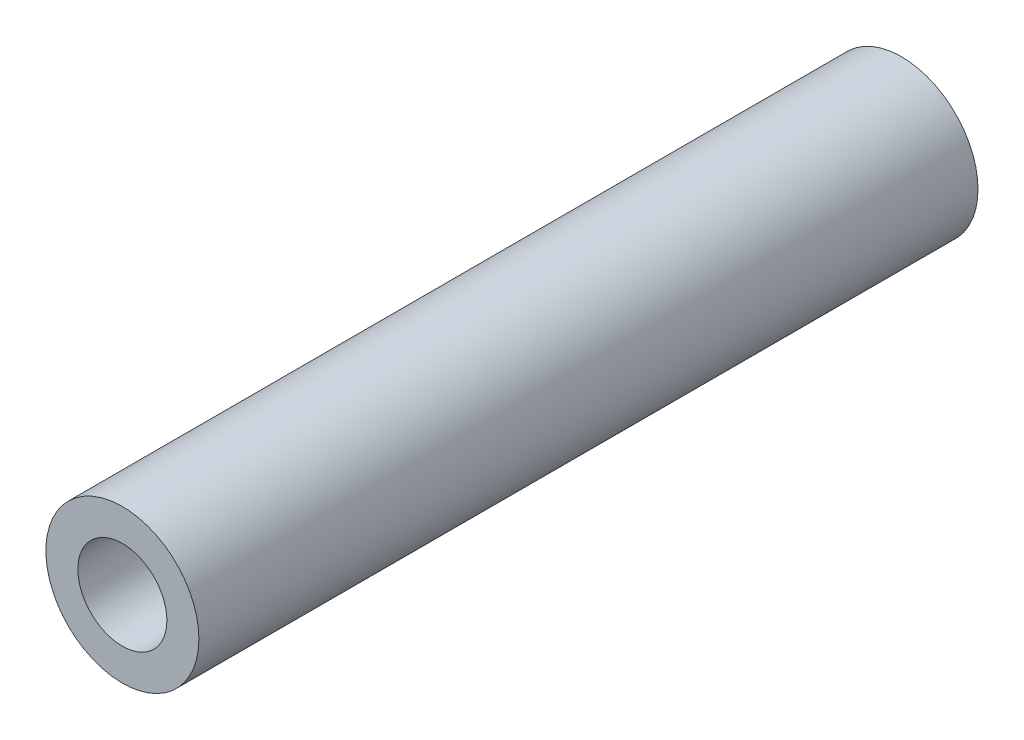
ISO-10303-21;
HEADER;
FILE_DESCRIPTION(('STEP AP214'),'2;1');
FILE_NAME('part.step','',(''),(''),'','','');
FILE_SCHEMA(('AUTOMOTIVE_DESIGN { 1 0 10303 214 1 1 1 1 }'));
ENDSEC;
DATA;
#1=APPLICATION_CONTEXT('core data for automotive mechanical design processes');
#2=APPLICATION_PROTOCOL_DEFINITION('international standard','automotive_design',2000,#1);
#3=PRODUCT_CONTEXT('',#1,'mechanical');
#4=PRODUCT('Part','Part','',(#3));
#5=PRODUCT_RELATED_PRODUCT_CATEGORY('part','',(#4));
#6=PRODUCT_DEFINITION_FORMATION('','',#4);
#7=PRODUCT_DEFINITION_CONTEXT('part definition',#1,'design');
#8=PRODUCT_DEFINITION('design','',#6,#7);
#9=PRODUCT_DEFINITION_SHAPE('','',#8);
#10=(LENGTH_UNIT() NAMED_UNIT(*) SI_UNIT(.MILLI.,.METRE.));
#11=(NAMED_UNIT(*) PLANE_ANGLE_UNIT() SI_UNIT($,.RADIAN.));
#12=(NAMED_UNIT(*) SI_UNIT($,.STERADIAN.) SOLID_ANGLE_UNIT());
#13=UNCERTAINTY_MEASURE_WITH_UNIT(LENGTH_MEASURE(1.E-05),#10,'distance_accuracy_value','');
#14=(GEOMETRIC_REPRESENTATION_CONTEXT(3) GLOBAL_UNCERTAINTY_ASSIGNED_CONTEXT((#13)) GLOBAL_UNIT_ASSIGNED_CONTEXT((#10,
#11,#12)) REPRESENTATION_CONTEXT('',''));
#15=CARTESIAN_POINT('',(0.,0.,0.));
#16=DIRECTION('',(0.,0.,1.));
#17=DIRECTION('',(1.,0.,0.));
#18=AXIS2_PLACEMENT_3D('',#15,#16,#17);
#19=CARTESIAN_POINT('',(0.,0.,28.));
#20=DIRECTION('',(0.,0.,1.));
#21=DIRECTION('',(1.,0.,0.));
#22=AXIS2_PLACEMENT_3D('',#19,#20,#21);
#23=PLANE('',#22);
#24=CARTESIAN_POINT('',(0.,0.,28.));
#25=DIRECTION('',(0.,0.,1.));
#26=DIRECTION('',(1.,0.,0.));
#27=AXIS2_PLACEMENT_3D('',#24,#25,#26);
#28=CIRCLE('',#27,2.75);
#29=CARTESIAN_POINT('',(2.75,0.,28.));
#30=VERTEX_POINT('',#29);
#31=EDGE_CURVE('E10',#30,#30,#28,.T.);
#32=ORIENTED_EDGE('',*,*,#31,.T.);
#33=EDGE_LOOP('',(#32));
#34=FACE_BOUND('',#33,.T.);
#35=CARTESIAN_POINT('',(0.,0.,28.));
#36=DIRECTION('',(0.,0.,1.));
#37=DIRECTION('',(1.,0.,0.));
#38=AXIS2_PLACEMENT_3D('',#35,#36,#37);
#39=CIRCLE('',#38,1.6);
#40=CARTESIAN_POINT('',(1.6,0.,28.));
#41=VERTEX_POINT('',#40);
#42=EDGE_CURVE('E50',#41,#41,#39,.T.);
#43=ORIENTED_EDGE('',*,*,#42,.F.);
#44=EDGE_LOOP('',(#43));
#45=FACE_BOUND('',#44,.T.);
#46=ADVANCED_FACE('F37',(#34,#45),#23,.T.);
#47=CARTESIAN_POINT('',(0.,0.,0.));
#48=DIRECTION('',(0.,0.,1.));
#49=DIRECTION('',(1.,0.,0.));
#50=AXIS2_PLACEMENT_3D('',#47,#48,#49);
#51=PLANE('',#50);
#52=CARTESIAN_POINT('',(0.,0.,0.));
#53=DIRECTION('',(0.,0.,1.));
#54=DIRECTION('',(1.,0.,0.));
#55=AXIS2_PLACEMENT_3D('',#52,#53,#54);
#56=CIRCLE('',#55,2.75);
#57=CARTESIAN_POINT('',(2.75,0.,0.));
#58=VERTEX_POINT('',#57);
#59=EDGE_CURVE('E41',#58,#58,#56,.T.);
#60=ORIENTED_EDGE('',*,*,#59,.F.);
#61=EDGE_LOOP('',(#60));
#62=FACE_BOUND('',#61,.T.);
#63=CARTESIAN_POINT('',(0.,0.,0.));
#64=DIRECTION('',(0.,0.,1.));
#65=DIRECTION('',(1.,0.,0.));
#66=AXIS2_PLACEMENT_3D('',#63,#64,#65);
#67=CIRCLE('',#66,1.6);
#68=CARTESIAN_POINT('',(1.6,0.,0.));
#69=VERTEX_POINT('',#68);
#70=EDGE_CURVE('E52',#69,#69,#67,.T.);
#71=ORIENTED_EDGE('',*,*,#70,.T.);
#72=EDGE_LOOP('',(#71));
#73=FACE_BOUND('',#72,.T.);
#74=ADVANCED_FACE('F64',(#62,#73),#51,.F.);
#75=CARTESIAN_POINT('',(0.,0.,28.));
#76=DIRECTION('',(0.,0.,-1.));
#77=DIRECTION('',(-1.,0.,0.));
#78=AXIS2_PLACEMENT_3D('',#75,#76,#77);
#79=CYLINDRICAL_SURFACE('',#78,2.75);
#80=ORIENTED_EDGE('',*,*,#31,.F.);
#81=EDGE_LOOP('',(#80));
#82=FACE_BOUND('',#81,.T.);
#83=ORIENTED_EDGE('',*,*,#59,.T.);
#84=EDGE_LOOP('',(#83));
#85=FACE_BOUND('',#84,.T.);
#86=ADVANCED_FACE('F39',(#82,#85),#79,.T.);
#87=CARTESIAN_POINT('',(0.,0.,28.));
#88=DIRECTION('',(0.,0.,-1.));
#89=DIRECTION('',(-1.,0.,0.));
#90=AXIS2_PLACEMENT_3D('',#87,#88,#89);
#91=CYLINDRICAL_SURFACE('',#90,1.6);
#92=ORIENTED_EDGE('',*,*,#42,.T.);
#93=EDGE_LOOP('',(#92));
#94=FACE_BOUND('',#93,.T.);
#95=ORIENTED_EDGE('',*,*,#70,.F.);
#96=EDGE_LOOP('',(#95));
#97=FACE_BOUND('',#96,.T.);
#98=ADVANCED_FACE('F60',(#94,#97),#91,.F.);
#99=CLOSED_SHELL('',(#46,#74,#86,#98));
#100=MANIFOLD_SOLID_BREP('B2',#99);
#101=ADVANCED_BREP_SHAPE_REPRESENTATION('',(#18,#100),#14);
#102=SHAPE_DEFINITION_REPRESENTATION(#9,#101);
ENDSEC;
END-ISO-10303-21;
